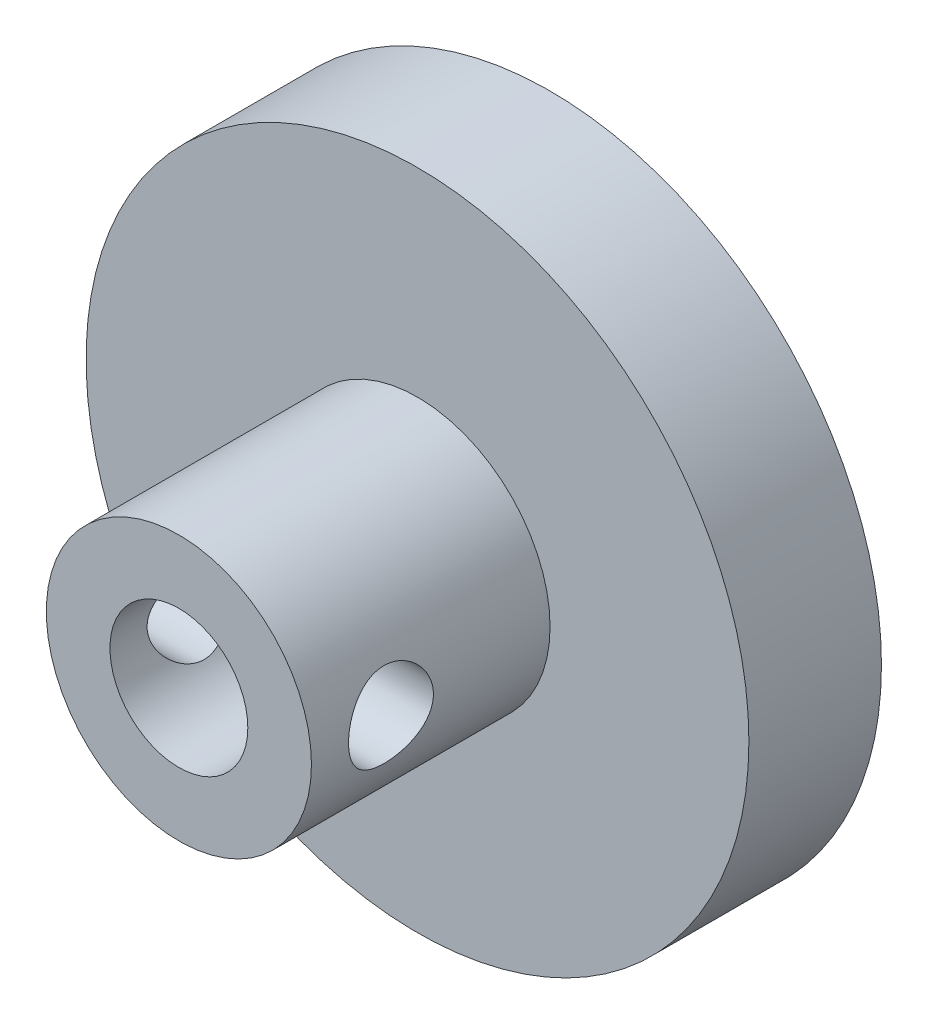
ISO-10303-21;
HEADER;
FILE_DESCRIPTION(('STEP AP214'),'2;1');
FILE_NAME('part.step','',(''),(''),'','','');
FILE_SCHEMA(('AUTOMOTIVE_DESIGN { 1 0 10303 214 1 1 1 1 }'));
ENDSEC;
DATA;
#1=APPLICATION_CONTEXT('core data for automotive mechanical design processes');
#2=APPLICATION_PROTOCOL_DEFINITION('international standard','automotive_design',2000,#1);
#3=PRODUCT_CONTEXT('',#1,'mechanical');
#4=PRODUCT('Part','Part','',(#3));
#5=PRODUCT_RELATED_PRODUCT_CATEGORY('part','',(#4));
#6=PRODUCT_DEFINITION_FORMATION('','',#4);
#7=PRODUCT_DEFINITION_CONTEXT('part definition',#1,'design');
#8=PRODUCT_DEFINITION('design','',#6,#7);
#9=PRODUCT_DEFINITION_SHAPE('','',#8);
#10=(LENGTH_UNIT() NAMED_UNIT(*) SI_UNIT(.MILLI.,.METRE.));
#11=(NAMED_UNIT(*) PLANE_ANGLE_UNIT() SI_UNIT($,.RADIAN.));
#12=(NAMED_UNIT(*) SI_UNIT($,.STERADIAN.) SOLID_ANGLE_UNIT());
#13=UNCERTAINTY_MEASURE_WITH_UNIT(LENGTH_MEASURE(1.E-05),#10,'distance_accuracy_value','');
#14=(GEOMETRIC_REPRESENTATION_CONTEXT(3) GLOBAL_UNCERTAINTY_ASSIGNED_CONTEXT((#13)) GLOBAL_UNIT_ASSIGNED_CONTEXT((#10,
#11,#12)) REPRESENTATION_CONTEXT('',''));
#15=CARTESIAN_POINT('',(0.,0.,0.));
#16=DIRECTION('',(0.,0.,1.));
#17=DIRECTION('',(1.,0.,0.));
#18=AXIS2_PLACEMENT_3D('',#15,#16,#17);
#19=CARTESIAN_POINT('',(0.,0.,5.));
#20=DIRECTION('',(0.,0.,-1.));
#21=DIRECTION('',(-1.,0.,0.));
#22=AXIS2_PLACEMENT_3D('',#19,#20,#21);
#23=CYLINDRICAL_SURFACE('',#22,2.6);
#24=CARTESIAN_POINT('',(2.6,0.,12.6));
#25=CARTESIAN_POINT('',(2.59999432765887,-0.0815050609204399,12.5999937910499));
#26=CARTESIAN_POINT('',(2.59612633604927,-0.163123282679852,12.5937288513961));
#27=CARTESIAN_POINT('',(2.58101901831581,-0.323873748856226,12.5689968717903));
#28=CARTESIAN_POINT('',(2.5697640122485,-0.403000329177078,12.5505038754999));
#29=CARTESIAN_POINT('',(2.54101835576085,-0.556115785705504,12.5023794225372));
#30=CARTESIAN_POINT('',(2.52355863246842,-0.630128007090817,12.4728031707059));
#31=CARTESIAN_POINT('',(2.4838698101521,-0.771892103153211,12.4037120140264));
#32=CARTESIAN_POINT('',(2.46164148612966,-0.839644992551234,12.3641987239836));
#33=CARTESIAN_POINT('',(2.4122049761537,-0.972991033108677,12.2729186982759));
#34=CARTESIAN_POINT('',(2.38474271797823,-1.03799601997696,12.2204330315088));
#35=CARTESIAN_POINT('',(2.32841486285422,-1.15885300717105,12.1063360538204));
#36=CARTESIAN_POINT('',(2.29954744746964,-1.21469271501715,12.0447126947605));
#37=CARTESIAN_POINT('',(2.23917247882213,-1.32303799606456,11.9046568717682));
#38=CARTESIAN_POINT('',(2.20781174176567,-1.37415847067318,11.8250803203463));
#39=CARTESIAN_POINT('',(2.15056538391552,-1.46213290877857,11.656625223673));
#40=CARTESIAN_POINT('',(2.12467067180695,-1.49901064751903,11.5677624976364));
#41=CARTESIAN_POINT('',(2.08814960959921,-1.54930406025277,11.4060831937996));
#42=CARTESIAN_POINT('',(2.07531908567476,-1.56629241499258,11.3348787061207));
#43=CARTESIAN_POINT('',(2.0569236304322,-1.59037831730189,11.1899354781139));
#44=CARTESIAN_POINT('',(2.05134892505402,-1.59748917137855,11.1162002846097));
#45=CARTESIAN_POINT('',(2.04829838239002,-1.60140000524565,10.968109049279));
#46=CARTESIAN_POINT('',(2.05084158943001,-1.5981757391474,10.8937519562968));
#47=CARTESIAN_POINT('',(2.06366592270936,-1.58157706911089,10.7468428533291));
#48=CARTESIAN_POINT('',(2.07395311335108,-1.56819471018502,10.6742923040927));
#49=CARTESIAN_POINT('',(2.10055355425886,-1.53236888311116,10.5341857499255));
#50=CARTESIAN_POINT('',(2.11674992785911,-1.51010042035929,10.4665615072079));
#51=CARTESIAN_POINT('',(2.15340339663207,-1.45735481819131,10.3358536682683));
#52=CARTESIAN_POINT('',(2.17386201738601,-1.4268747384523,10.2727717087689));
#53=CARTESIAN_POINT('',(2.2212399995751,-1.35217746728285,10.1407132980947));
#54=CARTESIAN_POINT('',(2.24865722508276,-1.30646889679042,10.0727590733654));
#55=CARTESIAN_POINT('',(2.3043914104903,-1.20545230874156,9.94475464107295));
#56=CARTESIAN_POINT('',(2.3327092492489,-1.15013466381591,9.88471246774933));
#57=CARTESIAN_POINT('',(2.3922061796201,-1.02133395116945,9.76478072231473));
#58=CARTESIAN_POINT('',(2.42314989393608,-0.946364504736802,9.70635267007986));
#59=CARTESIAN_POINT('',(2.47985671535154,-0.785838198665152,9.60302030101511));
#60=CARTESIAN_POINT('',(2.50562217632452,-0.700286178237707,9.55810983486829));
#61=CARTESIAN_POINT('',(2.54775084717593,-0.525866544188023,9.48611918484017));
#62=CARTESIAN_POINT('',(2.56457271172847,-0.437479030153941,9.45815592512466));
#63=CARTESIAN_POINT('',(2.58897650338787,-0.256012561754683,9.41789313283454));
#64=CARTESIAN_POINT('',(2.59657071359287,-0.162940016072435,9.40557277672293));
#65=CARTESIAN_POINT('',(2.60121689168211,0.0107000897575631,9.39802320927808));
#66=CARTESIAN_POINT('',(2.59962595226887,0.0911444155408097,9.40059404817486));
#67=CARTESIAN_POINT('',(2.58915437811487,0.250262502750865,9.41767036936969));
#68=CARTESIAN_POINT('',(2.58027409064427,0.328936348341267,9.43217528311934));
#69=CARTESIAN_POINT('',(2.55646105937856,0.479740248311528,9.47169027580754));
#70=CARTESIAN_POINT('',(2.5417386130307,0.552000752855066,9.49633634179888));
#71=CARTESIAN_POINT('',(2.50743752981804,0.691309458154682,9.5550742122116));
#72=CARTESIAN_POINT('',(2.48785802933808,0.758356729177035,9.58916769657044));
#73=CARTESIAN_POINT('',(2.44304653728973,0.892772478482512,9.66969549654854));
#74=CARTESIAN_POINT('',(2.41744115991295,0.959471812421614,9.71703561501738));
#75=CARTESIAN_POINT('',(2.3640150826591,1.08446464035279,9.82078571593363));
#76=CARTESIAN_POINT('',(2.33619187843364,1.14274841676333,9.87720602701803));
#77=CARTESIAN_POINT('',(2.27662024798774,1.25767528296851,10.0066430028911));
#78=CARTESIAN_POINT('',(2.24486642944566,1.31295187891575,10.0808770659878));
#79=CARTESIAN_POINT('',(2.18496484761235,1.41039070876453,10.2388238009709));
#80=CARTESIAN_POINT('',(2.15681405625199,1.45256399812194,10.3225284006263));
#81=CARTESIAN_POINT('',(2.11347093505912,1.51471487071257,10.4792802129763));
#82=CARTESIAN_POINT('',(2.09679546428934,1.53750749037509,10.5507956433617));
#83=CARTESIAN_POINT('',(2.0703468116985,1.5729466927527,10.6974897683771));
#84=CARTESIAN_POINT('',(2.06056326058839,1.58560852173947,10.7726627769901));
#85=CARTESIAN_POINT('',(2.04934732959704,1.60008371414143,10.9250706820924));
#86=CARTESIAN_POINT('',(2.04795600493154,1.60184374651664,11.0023138611624));
#87=CARTESIAN_POINT('',(2.0538778074208,1.59424126055069,11.1559284558077));
#88=CARTESIAN_POINT('',(2.06119470407539,1.58487392554504,11.2322994794044));
#89=CARTESIAN_POINT('',(2.08258574047693,1.55663636479337,11.3767472219792));
#90=CARTESIAN_POINT('',(2.09617050114748,1.53845016337926,11.4450358598907));
#91=CARTESIAN_POINT('',(2.12825367443449,1.49375042228436,11.5775880263686));
#92=CARTESIAN_POINT('',(2.14675402335594,1.46723360032691,11.6418499564152));
#93=CARTESIAN_POINT('',(2.18994213695553,1.40210331291971,11.7748404924836));
#94=CARTESIAN_POINT('',(2.21514119603816,1.36227555042389,11.8428058606633));
#95=CARTESIAN_POINT('',(2.26734051976138,1.27350852220838,11.9717580915195));
#96=CARTESIAN_POINT('',(2.29434225847407,1.22456173972648,12.032739129599));
#97=CARTESIAN_POINT('',(2.35297585731355,1.10836606700196,12.1576155770889));
#98=CARTESIAN_POINT('',(2.38454122516758,1.03940653072212,12.2199669918609));
#99=CARTESIAN_POINT('',(2.44400003799827,0.890668410895344,12.3324457345342));
#100=CARTESIAN_POINT('',(2.47189160581281,0.810884338390868,12.3825668243029));
#101=CARTESIAN_POINT('',(2.5207438074347,0.642936040806381,12.4681187823969));
#102=CARTESIAN_POINT('',(2.54178172662,0.554880803967076,12.5037146900548));
#103=CARTESIAN_POINT('',(2.56656685807807,0.418201881034892,12.5451149632011));
#104=CARTESIAN_POINT('',(2.57369623804224,0.371924138385447,12.5569103794696));
#105=CARTESIAN_POINT('',(2.58550183748825,0.278210640647866,12.5763506660413));
#106=CARTESIAN_POINT('',(2.59017995829682,0.230775813035509,12.5839987533941));
#107=CARTESIAN_POINT('',(2.5956908669241,0.152691717283585,12.5929902970265));
#108=CARTESIAN_POINT('',(2.59730401306435,0.122237485357849,12.5956161184722));
#109=CARTESIAN_POINT('',(2.59945967524074,0.0611941592403313,12.5991221856738));
#110=CARTESIAN_POINT('',(2.60000212995763,0.0306050574249994,12.6000023314537));
#111=CARTESIAN_POINT('',(2.6,0.,12.6));
#112=B_SPLINE_CURVE_WITH_KNOTS('',3,(#24,#25,#26,#27,#28,#29,#30,#31,#32,#33,#34,#35,#36,#37,
#38,#39,#40,#41,#42,#43,#44,#45,#46,#47,#48,#49,#50,#51,#52,#53,#54,#55,#56,#57,#58,#59,#60,#61,
#62,#63,#64,#65,#66,#67,#68,#69,#70,#71,#72,#73,#74,#75,#76,#77,#78,#79,#80,#81,#82,#83,#84,#85,
#86,#87,#88,#89,#90,#91,#92,#93,#94,#95,#96,#97,#98,#99,#100,#101,#102,#103,#104,#105,#106,#107,
#108,#109,#110,#111),.UNSPECIFIED.,.T.,.F.,(4,2,2,2,2,2,2,2,2,2,2,2,2,2,2,2,2,2,2,2,2,2,2,2,2,2,
2,2,2,2,2,2,2,2,2,2,2,2,2,2,2,2,2,4),(0.,0.244391395563191,0.489303230147808,0.733011051143268,
0.976679294277067,1.23949670790066,1.50266378198154,1.80015990002489,2.09715724219347,
2.31918142216986,2.54090621051842,2.76315153907185,2.98557109178186,3.20381086194982,
3.42212888104635,3.68025101267356,3.9386332654196,4.23700073913521,4.53523227594117,
4.81616642447083,5.09672620534383,5.3370034196759,5.57726918768117,5.80957377158104,
6.04191969035851,6.29804040099775,6.55445453295321,6.84668712277224,7.13867247780742,
7.3684157906785,7.59781269896912,7.82833092479004,8.05894897059872,8.27400245540912,
8.4891407780954,8.73636536466116,8.98379464615526,9.2769489167402,9.57025240090102,
9.8601236957936,10.0047742367736,10.1493124124041,10.2410758475242,10.3328445378474),.UNSPECIFIED.);
#113=CARTESIAN_POINT('',(2.6,0.,12.6));
#114=VERTEX_POINT('',#113);
#115=EDGE_CURVE('E92',#114,#114,#112,.T.);
#116=ORIENTED_EDGE('',*,*,#115,.T.);
#117=EDGE_LOOP('',(#116));
#118=FACE_BOUND('',#117,.T.);
#119=CARTESIAN_POINT('',(0.,0.,0.));
#120=DIRECTION('',(0.,0.,1.));
#121=DIRECTION('',(1.,0.,0.));
#122=AXIS2_PLACEMENT_3D('',#119,#120,#121);
#123=CIRCLE('',#122,2.6);
#124=CARTESIAN_POINT('',(2.6,0.,0.));
#125=VERTEX_POINT('',#124);
#126=EDGE_CURVE('E57',#125,#125,#123,.T.);
#127=ORIENTED_EDGE('',*,*,#126,.F.);
#128=EDGE_LOOP('',(#127));
#129=FACE_BOUND('',#128,.T.);
#130=CARTESIAN_POINT('',(0.,0.,14.));
#131=DIRECTION('',(0.,0.,1.));
#132=DIRECTION('',(1.,0.,0.));
#133=AXIS2_PLACEMENT_3D('',#130,#131,#132);
#134=CIRCLE('',#133,2.6);
#135=CARTESIAN_POINT('',(2.6,0.,14.));
#136=VERTEX_POINT('',#135);
#137=EDGE_CURVE('E123',#136,#136,#134,.T.);
#138=ORIENTED_EDGE('',*,*,#137,.T.);
#139=EDGE_LOOP('',(#138));
#140=FACE_BOUND('',#139,.T.);
#141=CARTESIAN_POINT('',(-2.6,0.,12.6));
#142=CARTESIAN_POINT('',(-2.59999432765887,0.0815050609204399,12.5999937910499));
#143=CARTESIAN_POINT('',(-2.59612633604927,0.163123282679852,12.5937288513961));
#144=CARTESIAN_POINT('',(-2.58101901831581,0.323873748856226,12.5689968717903));
#145=CARTESIAN_POINT('',(-2.5697640122485,0.403000329177078,12.5505038754999));
#146=CARTESIAN_POINT('',(-2.54101835576085,0.556115785705504,12.5023794225372));
#147=CARTESIAN_POINT('',(-2.52355863246842,0.630128007090817,12.4728031707059));
#148=CARTESIAN_POINT('',(-2.4838698101521,0.771892103153211,12.4037120140264));
#149=CARTESIAN_POINT('',(-2.46164148612966,0.839644992551234,12.3641987239836));
#150=CARTESIAN_POINT('',(-2.4122049761537,0.972991033108677,12.2729186982759));
#151=CARTESIAN_POINT('',(-2.38474271797823,1.03799601997696,12.2204330315088));
#152=CARTESIAN_POINT('',(-2.32841486285422,1.15885300717105,12.1063360538204));
#153=CARTESIAN_POINT('',(-2.29954744746964,1.21469271501715,12.0447126947605));
#154=CARTESIAN_POINT('',(-2.23917247882213,1.32303799606456,11.9046568717682));
#155=CARTESIAN_POINT('',(-2.20781174176567,1.37415847067318,11.8250803203463));
#156=CARTESIAN_POINT('',(-2.15056538391552,1.46213290877857,11.656625223673));
#157=CARTESIAN_POINT('',(-2.12467067180695,1.49901064751903,11.5677624976364));
#158=CARTESIAN_POINT('',(-2.08814960959921,1.54930406025277,11.4060831937996));
#159=CARTESIAN_POINT('',(-2.07531908567476,1.56629241499258,11.3348787061207));
#160=CARTESIAN_POINT('',(-2.0569236304322,1.59037831730189,11.1899354781139));
#161=CARTESIAN_POINT('',(-2.05134892505402,1.59748917137855,11.1162002846097));
#162=CARTESIAN_POINT('',(-2.04829838239002,1.60140000524565,10.968109049279));
#163=CARTESIAN_POINT('',(-2.05084158943001,1.5981757391474,10.8937519562968));
#164=CARTESIAN_POINT('',(-2.06366592270936,1.58157706911089,10.7468428533291));
#165=CARTESIAN_POINT('',(-2.07395311335108,1.56819471018502,10.6742923040927));
#166=CARTESIAN_POINT('',(-2.10055355425886,1.53236888311116,10.5341857499255));
#167=CARTESIAN_POINT('',(-2.11674992785911,1.51010042035929,10.4665615072079));
#168=CARTESIAN_POINT('',(-2.15340339663207,1.45735481819131,10.3358536682683));
#169=CARTESIAN_POINT('',(-2.17386201738601,1.4268747384523,10.2727717087689));
#170=CARTESIAN_POINT('',(-2.2212399995751,1.35217746728285,10.1407132980947));
#171=CARTESIAN_POINT('',(-2.24865722508276,1.30646889679042,10.0727590733654));
#172=CARTESIAN_POINT('',(-2.3043914104903,1.20545230874156,9.94475464107295));
#173=CARTESIAN_POINT('',(-2.3327092492489,1.15013466381591,9.88471246774933));
#174=CARTESIAN_POINT('',(-2.3922061796201,1.02133395116945,9.76478072231473));
#175=CARTESIAN_POINT('',(-2.42314989393608,0.946364504736802,9.70635267007986));
#176=CARTESIAN_POINT('',(-2.47985671535154,0.785838198665152,9.60302030101511));
#177=CARTESIAN_POINT('',(-2.50562217632452,0.700286178237707,9.55810983486829));
#178=CARTESIAN_POINT('',(-2.54775084717593,0.525866544188023,9.48611918484017));
#179=CARTESIAN_POINT('',(-2.56457271172847,0.437479030153941,9.45815592512466));
#180=CARTESIAN_POINT('',(-2.58897650338787,0.256012561754683,9.41789313283454));
#181=CARTESIAN_POINT('',(-2.59657071359287,0.162940016072435,9.40557277672293));
#182=CARTESIAN_POINT('',(-2.60121689168211,-0.0107000897575631,9.39802320927808));
#183=CARTESIAN_POINT('',(-2.59962595226887,-0.0911444155408097,9.40059404817486));
#184=CARTESIAN_POINT('',(-2.58915437811487,-0.250262502750865,9.41767036936969));
#185=CARTESIAN_POINT('',(-2.58027409064427,-0.328936348341267,9.43217528311934));
#186=CARTESIAN_POINT('',(-2.55646105937856,-0.479740248311528,9.47169027580754));
#187=CARTESIAN_POINT('',(-2.5417386130307,-0.552000752855066,9.49633634179888));
#188=CARTESIAN_POINT('',(-2.50743752981804,-0.691309458154682,9.5550742122116));
#189=CARTESIAN_POINT('',(-2.48785802933808,-0.758356729177035,9.58916769657044));
#190=CARTESIAN_POINT('',(-2.44304653728973,-0.892772478482512,9.66969549654854));
#191=CARTESIAN_POINT('',(-2.41744115991295,-0.959471812421614,9.71703561501738));
#192=CARTESIAN_POINT('',(-2.3640150826591,-1.08446464035279,9.82078571593363));
#193=CARTESIAN_POINT('',(-2.33619187843364,-1.14274841676333,9.87720602701803));
#194=CARTESIAN_POINT('',(-2.27662024798774,-1.25767528296851,10.0066430028911));
#195=CARTESIAN_POINT('',(-2.24486642944566,-1.31295187891575,10.0808770659878));
#196=CARTESIAN_POINT('',(-2.18496484761235,-1.41039070876453,10.2388238009709));
#197=CARTESIAN_POINT('',(-2.15681405625199,-1.45256399812194,10.3225284006263));
#198=CARTESIAN_POINT('',(-2.11347093505912,-1.51471487071257,10.4792802129763));
#199=CARTESIAN_POINT('',(-2.09679546428934,-1.53750749037509,10.5507956433617));
#200=CARTESIAN_POINT('',(-2.0703468116985,-1.5729466927527,10.6974897683771));
#201=CARTESIAN_POINT('',(-2.06056326058839,-1.58560852173947,10.7726627769901));
#202=CARTESIAN_POINT('',(-2.04934732959704,-1.60008371414143,10.9250706820924));
#203=CARTESIAN_POINT('',(-2.04795600493154,-1.60184374651664,11.0023138611624));
#204=CARTESIAN_POINT('',(-2.0538778074208,-1.59424126055069,11.1559284558077));
#205=CARTESIAN_POINT('',(-2.06119470407539,-1.58487392554504,11.2322994794044));
#206=CARTESIAN_POINT('',(-2.08258574047693,-1.55663636479337,11.3767472219792));
#207=CARTESIAN_POINT('',(-2.09617050114748,-1.53845016337926,11.4450358598907));
#208=CARTESIAN_POINT('',(-2.12825367443449,-1.49375042228436,11.5775880263686));
#209=CARTESIAN_POINT('',(-2.14675402335594,-1.46723360032691,11.6418499564152));
#210=CARTESIAN_POINT('',(-2.18994213695553,-1.40210331291971,11.7748404924836));
#211=CARTESIAN_POINT('',(-2.21514119603816,-1.36227555042389,11.8428058606633));
#212=CARTESIAN_POINT('',(-2.26734051976138,-1.27350852220838,11.9717580915195));
#213=CARTESIAN_POINT('',(-2.29434225847407,-1.22456173972648,12.032739129599));
#214=CARTESIAN_POINT('',(-2.35297585731355,-1.10836606700196,12.1576155770889));
#215=CARTESIAN_POINT('',(-2.38454122516758,-1.03940653072212,12.2199669918609));
#216=CARTESIAN_POINT('',(-2.44400003799827,-0.890668410895344,12.3324457345342));
#217=CARTESIAN_POINT('',(-2.47189160581281,-0.810884338390868,12.3825668243029));
#218=CARTESIAN_POINT('',(-2.5207438074347,-0.642936040806381,12.4681187823969));
#219=CARTESIAN_POINT('',(-2.54178172662,-0.554880803967076,12.5037146900548));
#220=CARTESIAN_POINT('',(-2.56656685807807,-0.418201881034892,12.5451149632011));
#221=CARTESIAN_POINT('',(-2.57369623804224,-0.371924138385447,12.5569103794696));
#222=CARTESIAN_POINT('',(-2.58550183748825,-0.278210640647866,12.5763506660413));
#223=CARTESIAN_POINT('',(-2.59017995829682,-0.230775813035509,12.5839987533941));
#224=CARTESIAN_POINT('',(-2.5956908669241,-0.152691717283585,12.5929902970265));
#225=CARTESIAN_POINT('',(-2.59730401306435,-0.122237485357849,12.5956161184722));
#226=CARTESIAN_POINT('',(-2.59945967524074,-0.0611941592403313,12.5991221856738));
#227=CARTESIAN_POINT('',(-2.60000212995763,-0.0306050574249994,12.6000023314537));
#228=CARTESIAN_POINT('',(-2.6,0.,12.6));
#229=B_SPLINE_CURVE_WITH_KNOTS('',3,(#141,#142,#143,#144,#145,#146,#147,#148,#149,#150,#151,
#152,#153,#154,#155,#156,#157,#158,#159,#160,#161,#162,#163,#164,#165,#166,#167,#168,#169,#170,
#171,#172,#173,#174,#175,#176,#177,#178,#179,#180,#181,#182,#183,#184,#185,#186,#187,#188,#189,
#190,#191,#192,#193,#194,#195,#196,#197,#198,#199,#200,#201,#202,#203,#204,#205,#206,#207,#208,
#209,#210,#211,#212,#213,#214,#215,#216,#217,#218,#219,#220,#221,#222,#223,#224,#225,#226,#227,
#228),.UNSPECIFIED.,.T.,.F.,(4,2,2,2,2,2,2,2,2,2,2,2,2,2,2,2,2,2,2,2,2,2,2,2,2,2,2,2,2,2,2,2,2,
2,2,2,2,2,2,2,2,2,2,4),(0.,0.244391395563191,0.489303230147808,0.733011051143268,
0.976679294277067,1.23949670790066,1.50266378198154,1.80015990002489,2.09715724219347,
2.31918142216986,2.54090621051842,2.76315153907185,2.98557109178186,3.20381086194982,
3.42212888104635,3.68025101267356,3.9386332654196,4.23700073913521,4.53523227594117,
4.81616642447083,5.09672620534383,5.3370034196759,5.57726918768117,5.80957377158104,
6.04191969035851,6.29804040099775,6.55445453295321,6.84668712277224,7.13867247780742,
7.3684157906785,7.59781269896912,7.82833092479004,8.05894897059872,8.27400245540912,
8.4891407780954,8.73636536466116,8.98379464615526,9.2769489167402,9.57025240090102,
9.8601236957936,10.0047742367736,10.1493124124041,10.2410758475242,10.3328445378474),.UNSPECIFIED.);
#230=CARTESIAN_POINT('',(-2.6,0.,12.6));
#231=VERTEX_POINT('',#230);
#232=EDGE_CURVE('E98',#231,#231,#229,.T.);
#233=ORIENTED_EDGE('',*,*,#232,.T.);
#234=EDGE_LOOP('',(#233));
#235=FACE_BOUND('',#234,.T.);
#236=ADVANCED_FACE('F43',(#118,#129,#140,#235),#23,.F.);
#237=CARTESIAN_POINT('',(0.,0.,14.));
#238=DIRECTION('',(0.,0.,-1.));
#239=DIRECTION('',(-1.,0.,0.));
#240=AXIS2_PLACEMENT_3D('',#237,#238,#239);
#241=CYLINDRICAL_SURFACE('',#240,5.);
#242=CARTESIAN_POINT('',(0.,0.,5.));
#243=DIRECTION('',(0.,0.,1.));
#244=DIRECTION('',(1.,0.,0.));
#245=AXIS2_PLACEMENT_3D('',#242,#243,#244);
#246=CIRCLE('',#245,5.);
#247=CARTESIAN_POINT('',(5.,0.,5.));
#248=VERTEX_POINT('',#247);
#249=EDGE_CURVE('E67',#248,#248,#246,.F.);
#250=ORIENTED_EDGE('',*,*,#249,.F.);
#251=EDGE_LOOP('',(#250));
#252=FACE_BOUND('',#251,.T.);
#253=CARTESIAN_POINT('',(0.,0.,14.));
#254=DIRECTION('',(0.,0.,1.));
#255=DIRECTION('',(1.,0.,0.));
#256=AXIS2_PLACEMENT_3D('',#253,#254,#255);
#257=CIRCLE('',#256,5.);
#258=CARTESIAN_POINT('',(5.,0.,14.));
#259=VERTEX_POINT('',#258);
#260=EDGE_CURVE('E126',#259,#259,#257,.T.);
#261=ORIENTED_EDGE('',*,*,#260,.F.);
#262=EDGE_LOOP('',(#261));
#263=FACE_BOUND('',#262,.T.);
#264=CARTESIAN_POINT('',(5.,0.,12.6));
#265=CARTESIAN_POINT('',(4.99999978543627,-0.0874958063159797,12.5999997563494));
#266=CARTESIAN_POINT('',(4.99768184156355,-0.174994637059061,12.5927994047207));
#267=CARTESIAN_POINT('',(4.98866262172227,-0.347426901237483,12.5642681804707));
#268=CARTESIAN_POINT('',(4.98196054553558,-0.432359863373708,12.5429347281821));
#269=CARTESIAN_POINT('',(4.9649038363541,-0.597149225791566,12.4869350787882));
#270=CARTESIAN_POINT('',(4.95455502045191,-0.677013473384596,12.4522901076294));
#271=CARTESIAN_POINT('',(4.93126901642872,-0.829798762851158,12.3707431699127));
#272=CARTESIAN_POINT('',(4.91833138300386,-0.902718607024947,12.3238390942344));
#273=CARTESIAN_POINT('',(4.89077067933825,-1.04189475779498,12.217515886496));
#274=CARTESIAN_POINT('',(4.87610957732918,-1.1078960922464,12.1577729010466));
#275=CARTESIAN_POINT('',(4.8469706570307,-1.22913423693228,12.0281569334526));
#276=CARTESIAN_POINT('',(4.83249287552328,-1.28436891793797,11.9582819523451));
#277=CARTESIAN_POINT('',(4.80494810799029,-1.38391395073832,11.8081471454896));
#278=CARTESIAN_POINT('',(4.79192785635417,-1.42790123109944,11.7276637187295));
#279=CARTESIAN_POINT('',(4.76934657798645,-1.5016091713459,11.5599576562299));
#280=CARTESIAN_POINT('',(4.75978458968016,-1.53133379773327,11.4727369020117));
#281=CARTESIAN_POINT('',(4.74560122760597,-1.57473134311322,11.2969173927271));
#282=CARTESIAN_POINT('',(4.74083414932744,-1.58887896846386,11.208447898248));
#283=CARTESIAN_POINT('',(4.73634831045,-1.60220433058851,11.0302724008155));
#284=CARTESIAN_POINT('',(4.73662813227306,-1.6013862709372,10.940566752148));
#285=CARTESIAN_POINT('',(4.74207619100075,-1.58517380736381,10.7664344151118));
#286=CARTESIAN_POINT('',(4.7470401743042,-1.57038842132725,10.6819435465553));
#287=CARTESIAN_POINT('',(4.76096457446162,-1.52765058974139,10.5167111555779));
#288=CARTESIAN_POINT('',(4.76992543490025,-1.49969668269327,10.4359700504148));
#289=CARTESIAN_POINT('',(4.7909865416364,-1.43099645158812,10.2791021411743));
#290=CARTESIAN_POINT('',(4.80313229469362,-1.39006273103723,10.2030637800485));
#291=CARTESIAN_POINT('',(4.82917444861168,-1.29669494334068,10.0587379569732));
#292=CARTESIAN_POINT('',(4.8430713221454,-1.24425776827155,9.99045259725646));
#293=CARTESIAN_POINT('',(4.87186372141871,-1.12640551540387,9.86013532713372));
#294=CARTESIAN_POINT('',(4.8867752080818,-1.06048936249403,9.79855922306119));
#295=CARTESIAN_POINT('',(4.91533168114877,-0.919081432217151,9.68722132176635));
#296=CARTESIAN_POINT('',(4.92897656433707,-0.843588875652696,9.6374604868571));
#297=CARTESIAN_POINT('',(4.95361789744584,-0.684261580712375,9.55083655671977));
#298=CARTESIAN_POINT('',(4.96459080547942,-0.600361279440636,9.51408689916357));
#299=CARTESIAN_POINT('',(4.98248161100196,-0.427135850361131,9.45536040333729));
#300=CARTESIAN_POINT('',(4.98940080204637,-0.337812463131549,9.43337885218328));
#301=CARTESIAN_POINT('',(4.99819424239135,-0.160141789589319,9.40559993333478));
#302=CARTESIAN_POINT('',(5.00026060178154,-0.0719002860170739,9.3991859263889));
#303=CARTESIAN_POINT('',(4.99968655318444,0.104410269588106,9.4009792182213));
#304=CARTESIAN_POINT('',(4.99704687004206,0.19247934608744,9.40918426530988));
#305=CARTESIAN_POINT('',(4.98748380317497,0.363535018203813,9.43949011308117));
#306=CARTESIAN_POINT('',(4.98067486649266,0.446594362478025,9.4612199100859));
#307=CARTESIAN_POINT('',(4.96357585995349,0.607861654600584,9.51750179939625));
#308=CARTESIAN_POINT('',(4.95328535439547,0.686068993794126,9.55205549660217));
#309=CARTESIAN_POINT('',(4.92995531019905,0.837596923870446,9.63397101717815));
#310=CARTESIAN_POINT('',(4.9168532627009,0.910745620500968,9.6816325119423));
#311=CARTESIAN_POINT('',(4.8893940824048,1.04821150300662,9.78805387298563));
#312=CARTESIAN_POINT('',(4.87503659432078,1.11252617555398,9.8468168864583));
#313=CARTESIAN_POINT('',(4.84592967283237,1.23328321488635,9.97667415961096));
#314=CARTESIAN_POINT('',(4.83118884166735,1.28928579475621,10.0481802676885));
#315=CARTESIAN_POINT('',(4.80360443110145,1.3885414199257,10.1998946744582));
#316=CARTESIAN_POINT('',(4.79076083607138,1.43179457025642,10.280102901454));
#317=CARTESIAN_POINT('',(4.76856262886575,1.50407580301232,10.4468435786561));
#318=CARTESIAN_POINT('',(4.75919656820051,1.53315066307446,10.5333541349897));
#319=CARTESIAN_POINT('',(4.74511281699328,1.57620668246201,10.7104072098103));
#320=CARTESIAN_POINT('',(4.74039324536734,1.59019395006567,10.800948081136));
#321=CARTESIAN_POINT('',(4.73633927898768,1.60222535311566,10.978875969164));
#322=CARTESIAN_POINT('',(4.73676019091382,1.60099388446006,11.066209011329));
#323=CARTESIAN_POINT('',(4.74234159093745,1.5843835514937,11.2393570054347));
#324=CARTESIAN_POINT('',(4.74750183734632,1.56900540861121,11.325172034561));
#325=CARTESIAN_POINT('',(4.76180543144416,1.52503332416461,11.4914834253769));
#326=CARTESIAN_POINT('',(4.77088327236763,1.49665627942706,11.5720431988929));
#327=CARTESIAN_POINT('',(4.79197975594362,1.42766427484382,11.7273217604008));
#328=CARTESIAN_POINT('',(4.8039990169992,1.38704674114626,11.8020393157627));
#329=CARTESIAN_POINT('',(4.83023494368376,1.29279266707432,11.9468096298144));
#330=CARTESIAN_POINT('',(4.8445211905268,1.23869308431579,12.016548262734));
#331=CARTESIAN_POINT('',(4.87337180847353,1.11981399792885,12.146191745821));
#332=CARTESIAN_POINT('',(4.88793625446696,1.05503158166823,12.2060939051986));
#333=CARTESIAN_POINT('',(4.91631108200117,0.913912210298353,12.3164582859238));
#334=CARTESIAN_POINT('',(4.93007751880386,0.837251351760781,12.3665189518843));
#335=CARTESIAN_POINT('',(4.9547378769786,0.676163529926938,12.4529801880972));
#336=CARTESIAN_POINT('',(4.96563279071293,0.591739263208158,12.4893854793208));
#337=CARTESIAN_POINT('',(4.98268341064065,0.423663431644846,12.5452477798304));
#338=CARTESIAN_POINT('',(4.98911901301451,0.340376766487331,12.5657184505831));
#339=CARTESIAN_POINT('',(4.99777693541394,0.17139400107612,12.593093142904));
#340=CARTESIAN_POINT('',(5.00000021015613,0.0856984512613951,12.6000002386455));
#341=CARTESIAN_POINT('',(5.,0.,12.6));
#342=B_SPLINE_CURVE_WITH_KNOTS('',3,(#264,#265,#266,#267,#268,#269,#270,#271,#272,#273,#274,
#275,#276,#277,#278,#279,#280,#281,#282,#283,#284,#285,#286,#287,#288,#289,#290,#291,#292,#293,
#294,#295,#296,#297,#298,#299,#300,#301,#302,#303,#304,#305,#306,#307,#308,#309,#310,#311,#312,
#313,#314,#315,#316,#317,#318,#319,#320,#321,#322,#323,#324,#325,#326,#327,#328,#329,#330,#331,
#332,#333,#334,#335,#336,#337,#338,#339,#340,#341),.UNSPECIFIED.,.T.,.F.,(4,2,2,2,2,2,2,2,2,2,2,
2,2,2,2,2,2,2,2,2,2,2,2,2,2,2,2,2,2,2,2,2,2,2,2,2,2,2,4),(0.,0.262172289866488,
0.524392446348365,0.786196202111713,1.04804502964703,1.31749718151567,1.58700256668426,
1.86354828826627,2.14001705671955,2.40780489999507,2.67551752794224,2.93207089351446,
3.18865273918779,3.44912195934764,3.70966163813009,3.98267284808623,4.25570628624555,
4.53106471334195,4.80633522466349,5.07051010591345,5.33464430132699,5.59183416387789,
5.84905622438334,6.11273355055082,6.37648573964819,6.6512299305306,6.92597185797943,
7.19980110675105,7.47351945288797,7.73426134972848,7.99498995042989,8.25151822881317,
8.50810048600706,8.77513756675923,9.04224757485584,9.31866285531261,9.59498248449731,
9.85182740305349,10.1086141011962),.UNSPECIFIED.);
#343=CARTESIAN_POINT('',(5.,0.,12.6));
#344=VERTEX_POINT('',#343);
#345=EDGE_CURVE('E71',#344,#344,#342,.T.);
#346=ORIENTED_EDGE('',*,*,#345,.F.);
#347=EDGE_LOOP('',(#346));
#348=FACE_BOUND('',#347,.T.);
#349=CARTESIAN_POINT('',(-5.,0.,12.6));
#350=CARTESIAN_POINT('',(-4.99999978543627,0.0874958063159797,12.5999997563494));
#351=CARTESIAN_POINT('',(-4.99768184156355,0.174994637059061,12.5927994047207));
#352=CARTESIAN_POINT('',(-4.98866262172227,0.347426901237483,12.5642681804707));
#353=CARTESIAN_POINT('',(-4.98196054553558,0.432359863373708,12.5429347281821));
#354=CARTESIAN_POINT('',(-4.9649038363541,0.597149225791566,12.4869350787882));
#355=CARTESIAN_POINT('',(-4.95455502045191,0.677013473384596,12.4522901076294));
#356=CARTESIAN_POINT('',(-4.93126901642872,0.829798762851158,12.3707431699127));
#357=CARTESIAN_POINT('',(-4.91833138300386,0.902718607024947,12.3238390942344));
#358=CARTESIAN_POINT('',(-4.89077067933825,1.04189475779498,12.217515886496));
#359=CARTESIAN_POINT('',(-4.87610957732918,1.1078960922464,12.1577729010466));
#360=CARTESIAN_POINT('',(-4.8469706570307,1.22913423693228,12.0281569334526));
#361=CARTESIAN_POINT('',(-4.83249287552328,1.28436891793797,11.9582819523451));
#362=CARTESIAN_POINT('',(-4.80494810799029,1.38391395073832,11.8081471454896));
#363=CARTESIAN_POINT('',(-4.79192785635417,1.42790123109944,11.7276637187295));
#364=CARTESIAN_POINT('',(-4.76934657798645,1.5016091713459,11.5599576562299));
#365=CARTESIAN_POINT('',(-4.75978458968016,1.53133379773327,11.4727369020117));
#366=CARTESIAN_POINT('',(-4.74560122760597,1.57473134311322,11.2969173927271));
#367=CARTESIAN_POINT('',(-4.74083414932744,1.58887896846386,11.208447898248));
#368=CARTESIAN_POINT('',(-4.73634831045,1.60220433058851,11.0302724008155));
#369=CARTESIAN_POINT('',(-4.73662813227306,1.6013862709372,10.940566752148));
#370=CARTESIAN_POINT('',(-4.74207619100075,1.58517380736381,10.7664344151118));
#371=CARTESIAN_POINT('',(-4.7470401743042,1.57038842132725,10.6819435465553));
#372=CARTESIAN_POINT('',(-4.76096457446162,1.52765058974139,10.5167111555779));
#373=CARTESIAN_POINT('',(-4.76992543490025,1.49969668269327,10.4359700504148));
#374=CARTESIAN_POINT('',(-4.7909865416364,1.43099645158812,10.2791021411743));
#375=CARTESIAN_POINT('',(-4.80313229469362,1.39006273103723,10.2030637800485));
#376=CARTESIAN_POINT('',(-4.82917444861168,1.29669494334068,10.0587379569732));
#377=CARTESIAN_POINT('',(-4.8430713221454,1.24425776827155,9.99045259725646));
#378=CARTESIAN_POINT('',(-4.87186372141871,1.12640551540387,9.86013532713372));
#379=CARTESIAN_POINT('',(-4.8867752080818,1.06048936249403,9.79855922306119));
#380=CARTESIAN_POINT('',(-4.91533168114877,0.919081432217151,9.68722132176635));
#381=CARTESIAN_POINT('',(-4.92897656433707,0.843588875652696,9.6374604868571));
#382=CARTESIAN_POINT('',(-4.95361789744584,0.684261580712375,9.55083655671977));
#383=CARTESIAN_POINT('',(-4.96459080547942,0.600361279440636,9.51408689916357));
#384=CARTESIAN_POINT('',(-4.98248161100196,0.427135850361131,9.45536040333729));
#385=CARTESIAN_POINT('',(-4.98940080204637,0.337812463131549,9.43337885218328));
#386=CARTESIAN_POINT('',(-4.99819424239135,0.160141789589319,9.40559993333478));
#387=CARTESIAN_POINT('',(-5.00026060178154,0.0719002860170739,9.3991859263889));
#388=CARTESIAN_POINT('',(-4.99968655318444,-0.104410269588106,9.4009792182213));
#389=CARTESIAN_POINT('',(-4.99704687004206,-0.19247934608744,9.40918426530988));
#390=CARTESIAN_POINT('',(-4.98748380317497,-0.363535018203813,9.43949011308117));
#391=CARTESIAN_POINT('',(-4.98067486649266,-0.446594362478025,9.4612199100859));
#392=CARTESIAN_POINT('',(-4.96357585995349,-0.607861654600584,9.51750179939625));
#393=CARTESIAN_POINT('',(-4.95328535439547,-0.686068993794126,9.55205549660217));
#394=CARTESIAN_POINT('',(-4.92995531019905,-0.837596923870446,9.63397101717815));
#395=CARTESIAN_POINT('',(-4.9168532627009,-0.910745620500968,9.6816325119423));
#396=CARTESIAN_POINT('',(-4.8893940824048,-1.04821150300662,9.78805387298563));
#397=CARTESIAN_POINT('',(-4.87503659432078,-1.11252617555398,9.8468168864583));
#398=CARTESIAN_POINT('',(-4.84592967283237,-1.23328321488635,9.97667415961096));
#399=CARTESIAN_POINT('',(-4.83118884166735,-1.28928579475621,10.0481802676885));
#400=CARTESIAN_POINT('',(-4.80360443110145,-1.3885414199257,10.1998946744582));
#401=CARTESIAN_POINT('',(-4.79076083607138,-1.43179457025642,10.280102901454));
#402=CARTESIAN_POINT('',(-4.76856262886575,-1.50407580301232,10.4468435786561));
#403=CARTESIAN_POINT('',(-4.75919656820051,-1.53315066307446,10.5333541349897));
#404=CARTESIAN_POINT('',(-4.74511281699328,-1.57620668246201,10.7104072098103));
#405=CARTESIAN_POINT('',(-4.74039324536734,-1.59019395006567,10.800948081136));
#406=CARTESIAN_POINT('',(-4.73633927898768,-1.60222535311566,10.978875969164));
#407=CARTESIAN_POINT('',(-4.73676019091382,-1.60099388446006,11.066209011329));
#408=CARTESIAN_POINT('',(-4.74234159093745,-1.5843835514937,11.2393570054347));
#409=CARTESIAN_POINT('',(-4.74750183734632,-1.56900540861121,11.325172034561));
#410=CARTESIAN_POINT('',(-4.76180543144416,-1.52503332416461,11.4914834253769));
#411=CARTESIAN_POINT('',(-4.77088327236763,-1.49665627942706,11.5720431988929));
#412=CARTESIAN_POINT('',(-4.79197975594362,-1.42766427484382,11.7273217604008));
#413=CARTESIAN_POINT('',(-4.8039990169992,-1.38704674114626,11.8020393157627));
#414=CARTESIAN_POINT('',(-4.83023494368376,-1.29279266707432,11.9468096298144));
#415=CARTESIAN_POINT('',(-4.8445211905268,-1.23869308431579,12.016548262734));
#416=CARTESIAN_POINT('',(-4.87337180847353,-1.11981399792885,12.146191745821));
#417=CARTESIAN_POINT('',(-4.88793625446696,-1.05503158166823,12.2060939051986));
#418=CARTESIAN_POINT('',(-4.91631108200117,-0.913912210298353,12.3164582859238));
#419=CARTESIAN_POINT('',(-4.93007751880386,-0.837251351760781,12.3665189518843));
#420=CARTESIAN_POINT('',(-4.9547378769786,-0.676163529926938,12.4529801880972));
#421=CARTESIAN_POINT('',(-4.96563279071293,-0.591739263208158,12.4893854793208));
#422=CARTESIAN_POINT('',(-4.98268341064065,-0.423663431644846,12.5452477798304));
#423=CARTESIAN_POINT('',(-4.98911901301451,-0.340376766487331,12.5657184505831));
#424=CARTESIAN_POINT('',(-4.99777693541394,-0.17139400107612,12.593093142904));
#425=CARTESIAN_POINT('',(-5.00000021015613,-0.0856984512613951,12.6000002386455));
#426=CARTESIAN_POINT('',(-5.,0.,12.6));
#427=B_SPLINE_CURVE_WITH_KNOTS('',3,(#349,#350,#351,#352,#353,#354,#355,#356,#357,#358,#359,
#360,#361,#362,#363,#364,#365,#366,#367,#368,#369,#370,#371,#372,#373,#374,#375,#376,#377,#378,
#379,#380,#381,#382,#383,#384,#385,#386,#387,#388,#389,#390,#391,#392,#393,#394,#395,#396,#397,
#398,#399,#400,#401,#402,#403,#404,#405,#406,#407,#408,#409,#410,#411,#412,#413,#414,#415,#416,
#417,#418,#419,#420,#421,#422,#423,#424,#425,#426),.UNSPECIFIED.,.T.,.F.,(4,2,2,2,2,2,2,2,2,2,2,
2,2,2,2,2,2,2,2,2,2,2,2,2,2,2,2,2,2,2,2,2,2,2,2,2,2,2,4),(0.,0.262172289866488,
0.524392446348365,0.786196202111713,1.04804502964703,1.31749718151567,1.58700256668426,
1.86354828826627,2.14001705671955,2.40780489999507,2.67551752794224,2.93207089351446,
3.18865273918779,3.44912195934764,3.70966163813009,3.98267284808623,4.25570628624555,
4.53106471334195,4.80633522466349,5.07051010591345,5.33464430132699,5.59183416387789,
5.84905622438334,6.11273355055082,6.37648573964819,6.6512299305306,6.92597185797943,
7.19980110675105,7.47351945288797,7.73426134972848,7.99498995042989,8.25151822881317,
8.50810048600706,8.77513756675923,9.04224757485584,9.31866285531261,9.59498248449731,
9.85182740305349,10.1086141011962),.UNSPECIFIED.);
#428=CARTESIAN_POINT('',(-5.,0.,12.6));
#429=VERTEX_POINT('',#428);
#430=EDGE_CURVE('E47',#429,#429,#427,.T.);
#431=ORIENTED_EDGE('',*,*,#430,.F.);
#432=EDGE_LOOP('',(#431));
#433=FACE_BOUND('',#432,.T.);
#434=ADVANCED_FACE('F77',(#252,#263,#348,#433),#241,.T.);
#435=CARTESIAN_POINT('',(0.,0.,5.));
#436=DIRECTION('',(0.,0.,1.));
#437=DIRECTION('',(1.,0.,0.));
#438=AXIS2_PLACEMENT_3D('',#435,#436,#437);
#439=PLANE('',#438);
#440=CARTESIAN_POINT('',(0.,0.,5.));
#441=DIRECTION('',(0.,0.,1.));
#442=DIRECTION('',(1.,0.,0.));
#443=AXIS2_PLACEMENT_3D('',#440,#441,#442);
#444=CIRCLE('',#443,12.5);
#445=CARTESIAN_POINT('',(12.5,0.,5.));
#446=VERTEX_POINT('',#445);
#447=EDGE_CURVE('E10',#446,#446,#444,.T.);
#448=ORIENTED_EDGE('',*,*,#447,.T.);
#449=EDGE_LOOP('',(#448));
#450=FACE_BOUND('',#449,.T.);
#451=ORIENTED_EDGE('',*,*,#249,.T.);
#452=EDGE_LOOP('',(#451));
#453=FACE_BOUND('',#452,.T.);
#454=ADVANCED_FACE('F111',(#450,#453),#439,.T.);
#455=CARTESIAN_POINT('',(0.,0.,5.));
#456=DIRECTION('',(0.,0.,-1.));
#457=DIRECTION('',(-1.,0.,0.));
#458=AXIS2_PLACEMENT_3D('',#455,#456,#457);
#459=CYLINDRICAL_SURFACE('',#458,12.5);
#460=ORIENTED_EDGE('',*,*,#447,.F.);
#461=EDGE_LOOP('',(#460));
#462=FACE_BOUND('',#461,.T.);
#463=CARTESIAN_POINT('',(0.,0.,0.));
#464=DIRECTION('',(0.,0.,1.));
#465=DIRECTION('',(1.,0.,0.));
#466=AXIS2_PLACEMENT_3D('',#463,#464,#465);
#467=CIRCLE('',#466,12.5);
#468=CARTESIAN_POINT('',(12.5,0.,0.));
#469=VERTEX_POINT('',#468);
#470=EDGE_CURVE('E63',#469,#469,#467,.T.);
#471=ORIENTED_EDGE('',*,*,#470,.T.);
#472=EDGE_LOOP('',(#471));
#473=FACE_BOUND('',#472,.T.);
#474=ADVANCED_FACE('F45',(#462,#473),#459,.T.);
#475=CARTESIAN_POINT('',(0.,0.,0.));
#476=DIRECTION('',(0.,0.,1.));
#477=DIRECTION('',(1.,0.,0.));
#478=AXIS2_PLACEMENT_3D('',#475,#476,#477);
#479=PLANE('',#478);
#480=ORIENTED_EDGE('',*,*,#126,.T.);
#481=EDGE_LOOP('',(#480));
#482=FACE_BOUND('',#481,.T.);
#483=ORIENTED_EDGE('',*,*,#470,.F.);
#484=EDGE_LOOP('',(#483));
#485=FACE_BOUND('',#484,.T.);
#486=ADVANCED_FACE('F107',(#482,#485),#479,.F.);
#487=CARTESIAN_POINT('',(0.,0.,14.));
#488=DIRECTION('',(0.,0.,1.));
#489=DIRECTION('',(1.,0.,0.));
#490=AXIS2_PLACEMENT_3D('',#487,#488,#489);
#491=PLANE('',#490);
#492=ORIENTED_EDGE('',*,*,#260,.T.);
#493=EDGE_LOOP('',(#492));
#494=FACE_BOUND('',#493,.T.);
#495=ORIENTED_EDGE('',*,*,#137,.F.);
#496=EDGE_LOOP('',(#495));
#497=FACE_BOUND('',#496,.T.);
#498=ADVANCED_FACE('F86',(#494,#497),#491,.T.);
#499=CARTESIAN_POINT('',(10.,0.,11.));
#500=DIRECTION('',(-1.,0.,0.));
#501=DIRECTION('',(0.,0.,1.));
#502=AXIS2_PLACEMENT_3D('',#499,#500,#501);
#503=CYLINDRICAL_SURFACE('',#502,1.6);
#504=ORIENTED_EDGE('',*,*,#115,.F.);
#505=EDGE_LOOP('',(#504));
#506=FACE_BOUND('',#505,.T.);
#507=ORIENTED_EDGE('',*,*,#345,.T.);
#508=EDGE_LOOP('',(#507));
#509=FACE_BOUND('',#508,.T.);
#510=ADVANCED_FACE('F84',(#506,#509),#503,.F.);
#511=ORIENTED_EDGE('',*,*,#232,.F.);
#512=EDGE_LOOP('',(#511));
#513=FACE_BOUND('',#512,.T.);
#514=ORIENTED_EDGE('',*,*,#430,.T.);
#515=EDGE_LOOP('',(#514));
#516=FACE_BOUND('',#515,.T.);
#517=ADVANCED_FACE('F81',(#513,#516),#503,.F.);
#518=CLOSED_SHELL('',(#236,#434,#454,#474,#486,#498,#510,#517));
#519=MANIFOLD_SOLID_BREP('B2',#518);
#520=ADVANCED_BREP_SHAPE_REPRESENTATION('',(#18,#519),#14);
#521=SHAPE_DEFINITION_REPRESENTATION(#9,#520);
ENDSEC;
END-ISO-10303-21;
